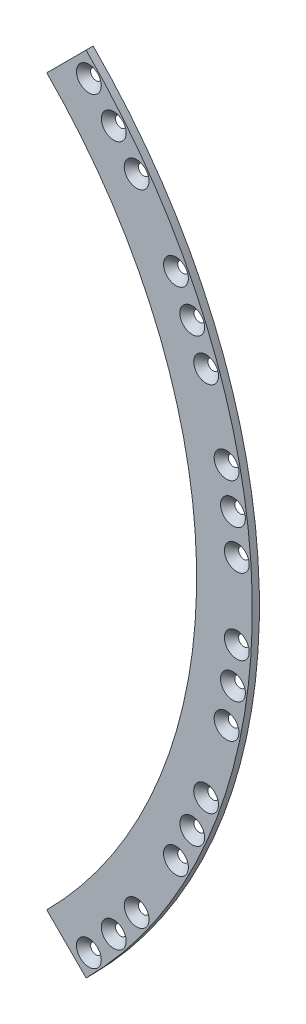
ISO-10303-21;
HEADER;
FILE_DESCRIPTION(('STEP AP214'),'2;1');
FILE_NAME('part.step','',(''),(''),'','','');
FILE_SCHEMA(('AUTOMOTIVE_DESIGN { 1 0 10303 214 1 1 1 1 }'));
ENDSEC;
DATA;
#1=APPLICATION_CONTEXT('core data for automotive mechanical design processes');
#2=APPLICATION_PROTOCOL_DEFINITION('international standard','automotive_design',2000,#1);
#3=PRODUCT_CONTEXT('',#1,'mechanical');
#4=PRODUCT('Part','Part','',(#3));
#5=PRODUCT_RELATED_PRODUCT_CATEGORY('part','',(#4));
#6=PRODUCT_DEFINITION_FORMATION('','',#4);
#7=PRODUCT_DEFINITION_CONTEXT('part definition',#1,'design');
#8=PRODUCT_DEFINITION('design','',#6,#7);
#9=PRODUCT_DEFINITION_SHAPE('','',#8);
#10=(LENGTH_UNIT() NAMED_UNIT(*) SI_UNIT(.MILLI.,.METRE.));
#11=(NAMED_UNIT(*) PLANE_ANGLE_UNIT() SI_UNIT($,.RADIAN.));
#12=(NAMED_UNIT(*) SI_UNIT($,.STERADIAN.) SOLID_ANGLE_UNIT());
#13=UNCERTAINTY_MEASURE_WITH_UNIT(LENGTH_MEASURE(1.E-05),#10,'distance_accuracy_value','');
#14=(GEOMETRIC_REPRESENTATION_CONTEXT(3) GLOBAL_UNCERTAINTY_ASSIGNED_CONTEXT((#13)) GLOBAL_UNIT_ASSIGNED_CONTEXT((#10,
#11,#12)) REPRESENTATION_CONTEXT('',''));
#15=CARTESIAN_POINT('',(0.,0.,0.));
#16=DIRECTION('',(0.,0.,1.));
#17=DIRECTION('',(1.,0.,0.));
#18=AXIS2_PLACEMENT_3D('',#15,#16,#17);
#19=CARTESIAN_POINT('',(0.,0.,2.));
#20=DIRECTION('',(0.,0.,-1.));
#21=DIRECTION('',(-1.,0.,0.));
#22=AXIS2_PLACEMENT_3D('',#19,#20,#21);
#23=PLANE('',#22);
#24=CARTESIAN_POINT('',(114.302744813103,-106.751311599393,2.));
#25=DIRECTION('',(0.,0.,-1.));
#26=DIRECTION('',(-1.,0.,0.));
#27=AXIS2_PLACEMENT_3D('',#24,#25,#26);
#28=CIRCLE('',#27,3.49999999998619);
#29=CARTESIAN_POINT('',(110.802744813116,-106.751311599393,2.));
#30=VERTEX_POINT('',#29);
#31=EDGE_CURVE('E11',#30,#30,#28,.T.);
#32=ORIENTED_EDGE('',*,*,#31,.T.);
#33=EDGE_LOOP('',(#32));
#34=FACE_BOUND('',#33,.T.);
#35=CARTESIAN_POINT('',(121.321245866172,-98.702154492594,2.));
#36=DIRECTION('',(0.,0.,-1.));
#37=DIRECTION('',(-1.,0.,0.));
#38=AXIS2_PLACEMENT_3D('',#35,#36,#37);
#39=CIRCLE('',#38,3.5);
#40=CARTESIAN_POINT('',(117.821245866172,-98.702154492594,2.));
#41=VERTEX_POINT('',#40);
#42=EDGE_CURVE('E41',#41,#41,#39,.T.);
#43=ORIENTED_EDGE('',*,*,#42,.T.);
#44=EDGE_LOOP('',(#43));
#45=FACE_BOUND('',#44,.T.);
#46=CARTESIAN_POINT('',(127.774091266831,-90.1928023787678,2.));
#47=DIRECTION('',(0.,0.,-1.));
#48=DIRECTION('',(-1.,0.,0.));
#49=AXIS2_PLACEMENT_3D('',#46,#47,#48);
#50=CIRCLE('',#49,3.50000000000325);
#51=CARTESIAN_POINT('',(124.274091266828,-90.1928023787678,2.));
#52=VERTEX_POINT('',#51);
#53=EDGE_CURVE('E152',#52,#52,#50,.T.);
#54=ORIENTED_EDGE('',*,*,#53,.T.);
#55=EDGE_LOOP('',(#54));
#56=FACE_BOUND('',#55,.T.);
#57=CARTESIAN_POINT('',(138.865248158134,-71.9541719011468,2.));
#58=DIRECTION('',(0.,0.,-1.));
#59=DIRECTION('',(-1.,0.,0.));
#60=AXIS2_PLACEMENT_3D('',#57,#58,#59);
#61=CIRCLE('',#60,3.4999999999889);
#62=CARTESIAN_POINT('',(135.365248158145,-71.9541719011468,2.));
#63=VERTEX_POINT('',#62);
#64=EDGE_CURVE('E149',#63,#63,#61,.T.);
#65=ORIENTED_EDGE('',*,*,#64,.T.);
#66=EDGE_LOOP('',(#65));
#67=FACE_BOUND('',#66,.T.);
#68=CARTESIAN_POINT('',(143.451847555453,-62.3099304519513,2.));
#69=DIRECTION('',(0.,0.,-1.));
#70=DIRECTION('',(-1.,0.,0.));
#71=AXIS2_PLACEMENT_3D('',#68,#69,#70);
#72=CIRCLE('',#71,3.5);
#73=CARTESIAN_POINT('',(139.951847555453,-62.3099304519513,2.));
#74=VERTEX_POINT('',#73);
#75=EDGE_CURVE('E146',#74,#74,#72,.T.);
#76=ORIENTED_EDGE('',*,*,#75,.T.);
#77=EDGE_LOOP('',(#76));
#78=FACE_BOUND('',#77,.T.);
#79=CARTESIAN_POINT('',(147.369608219383,-52.3751713435451,2.));
#80=DIRECTION('',(0.,0.,-1.));
#81=DIRECTION('',(-1.,0.,0.));
#82=AXIS2_PLACEMENT_3D('',#79,#80,#81);
#83=CIRCLE('',#82,3.5000000000025);
#84=CARTESIAN_POINT('',(143.86960821938,-52.3751713435451,2.));
#85=VERTEX_POINT('',#84);
#86=EDGE_CURVE('E143',#85,#85,#83,.T.);
#87=ORIENTED_EDGE('',*,*,#86,.T.);
#88=EDGE_LOOP('',(#87));
#89=FACE_BOUND('',#88,.T.);
#90=CARTESIAN_POINT('',(153.128751313515,-31.8205204414349,2.));
#91=DIRECTION('',(0.,0.,-1.));
#92=DIRECTION('',(-1.,0.,0.));
#93=AXIS2_PLACEMENT_3D('',#90,#91,#92);
#94=CIRCLE('',#93,3.50000000000203);
#95=CARTESIAN_POINT('',(149.628751313513,-31.8205204414349,2.));
#96=VERTEX_POINT('',#95);
#97=EDGE_CURVE('E140',#96,#96,#94,.T.);
#98=ORIENTED_EDGE('',*,*,#97,.T.);
#99=EDGE_LOOP('',(#98));
#100=FACE_BOUND('',#99,.T.);
#101=CARTESIAN_POINT('',(154.943281960082,-21.296463918652,2.));
#102=DIRECTION('',(0.,0.,-1.));
#103=DIRECTION('',(-1.,0.,0.));
#104=AXIS2_PLACEMENT_3D('',#101,#102,#103);
#105=CIRCLE('',#104,3.5);
#106=CARTESIAN_POINT('',(151.443281960082,-21.296463918652,2.));
#107=VERTEX_POINT('',#106);
#108=EDGE_CURVE('E137',#107,#107,#105,.T.);
#109=ORIENTED_EDGE('',*,*,#108,.T.);
#110=EDGE_LOOP('',(#109));
#111=FACE_BOUND('',#110,.T.);
#112=CARTESIAN_POINT('',(156.0353955014,-10.6731134502375,2.));
#113=DIRECTION('',(0.,0.,-1.));
#114=DIRECTION('',(-1.,0.,0.));
#115=AXIS2_PLACEMENT_3D('',#112,#113,#114);
#116=CIRCLE('',#115,3.50000000000156);
#117=CARTESIAN_POINT('',(152.535395501399,-10.6731134502375,2.));
#118=VERTEX_POINT('',#117);
#119=EDGE_CURVE('E134',#118,#118,#116,.T.);
#120=ORIENTED_EDGE('',*,*,#119,.T.);
#121=EDGE_LOOP('',(#120));
#122=FACE_BOUND('',#121,.T.);
#123=CARTESIAN_POINT('',(156.035395501401,10.6731134502307,2.));
#124=DIRECTION('',(0.,0.,-1.));
#125=DIRECTION('',(-1.,0.,0.));
#126=AXIS2_PLACEMENT_3D('',#123,#124,#125);
#127=CIRCLE('',#126,3.50000000000014);
#128=CARTESIAN_POINT('',(152.5353955014,10.6731134502307,2.));
#129=VERTEX_POINT('',#128);
#130=EDGE_CURVE('E131',#129,#129,#127,.T.);
#131=ORIENTED_EDGE('',*,*,#130,.T.);
#132=EDGE_LOOP('',(#131));
#133=FACE_BOUND('',#132,.T.);
#134=CARTESIAN_POINT('',(154.943281960082,21.2964639186541,2.));
#135=DIRECTION('',(0.,0.,-1.));
#136=DIRECTION('',(-1.,0.,0.));
#137=AXIS2_PLACEMENT_3D('',#134,#135,#136);
#138=CIRCLE('',#137,3.5);
#139=CARTESIAN_POINT('',(151.443281960082,21.2964639186541,2.));
#140=VERTEX_POINT('',#139);
#141=EDGE_CURVE('E128',#140,#140,#138,.T.);
#142=ORIENTED_EDGE('',*,*,#141,.T.);
#143=EDGE_LOOP('',(#142));
#144=FACE_BOUND('',#143,.T.);
#145=CARTESIAN_POINT('',(153.128751313516,31.8205204414281,2.));
#146=DIRECTION('',(0.,0.,-1.));
#147=DIRECTION('',(-1.,0.,0.));
#148=AXIS2_PLACEMENT_3D('',#145,#146,#147);
#149=CIRCLE('',#148,3.49999999999998);
#150=CARTESIAN_POINT('',(149.628751313516,31.8205204414281,2.));
#151=VERTEX_POINT('',#150);
#152=EDGE_CURVE('E125',#151,#151,#149,.T.);
#153=ORIENTED_EDGE('',*,*,#152,.T.);
#154=EDGE_LOOP('',(#153));
#155=FACE_BOUND('',#154,.T.);
#156=CARTESIAN_POINT('',(147.369608219384,52.3751713435407,2.));
#157=DIRECTION('',(0.,0.,-1.));
#158=DIRECTION('',(-1.,0.,0.));
#159=AXIS2_PLACEMENT_3D('',#156,#157,#158);
#160=CIRCLE('',#159,3.50000000000006);
#161=CARTESIAN_POINT('',(143.869608219384,52.3751713435407,2.));
#162=VERTEX_POINT('',#161);
#163=EDGE_CURVE('E122',#162,#162,#160,.T.);
#164=ORIENTED_EDGE('',*,*,#163,.T.);
#165=EDGE_LOOP('',(#164));
#166=FACE_BOUND('',#165,.T.);
#167=CARTESIAN_POINT('',(143.451847555452,62.3099304519534,2.));
#168=DIRECTION('',(0.,0.,-1.));
#169=DIRECTION('',(-1.,0.,0.));
#170=AXIS2_PLACEMENT_3D('',#167,#168,#169);
#171=CIRCLE('',#170,3.49999999999998);
#172=CARTESIAN_POINT('',(139.951847555452,62.3099304519534,2.));
#173=VERTEX_POINT('',#172);
#174=EDGE_CURVE('E119',#173,#173,#171,.T.);
#175=ORIENTED_EDGE('',*,*,#174,.T.);
#176=EDGE_LOOP('',(#175));
#177=FACE_BOUND('',#176,.T.);
#178=CARTESIAN_POINT('',(138.865248158133,71.9541719011488,2.));
#179=DIRECTION('',(0.,0.,-1.));
#180=DIRECTION('',(-1.,0.,0.));
#181=AXIS2_PLACEMENT_3D('',#178,#179,#180);
#182=CIRCLE('',#181,3.5);
#183=CARTESIAN_POINT('',(135.365248158133,71.9541719011488,2.));
#184=VERTEX_POINT('',#183);
#185=EDGE_CURVE('E116',#184,#184,#182,.T.);
#186=ORIENTED_EDGE('',*,*,#185,.T.);
#187=EDGE_LOOP('',(#186));
#188=FACE_BOUND('',#187,.T.);
#189=CARTESIAN_POINT('',(127.774091266834,90.1928023787642,2.));
#190=DIRECTION('',(0.,0.,-1.));
#191=DIRECTION('',(-1.,0.,0.));
#192=AXIS2_PLACEMENT_3D('',#189,#190,#191);
#193=CIRCLE('',#192,3.50000000000042);
#194=CARTESIAN_POINT('',(124.274091266834,90.1928023787642,2.));
#195=VERTEX_POINT('',#194);
#196=EDGE_CURVE('E113',#195,#195,#193,.T.);
#197=ORIENTED_EDGE('',*,*,#196,.T.);
#198=EDGE_LOOP('',(#197));
#199=FACE_BOUND('',#198,.T.);
#200=CARTESIAN_POINT('',(121.32124586617,98.7021544925957,2.));
#201=DIRECTION('',(0.,0.,-1.));
#202=DIRECTION('',(-1.,0.,0.));
#203=AXIS2_PLACEMENT_3D('',#200,#201,#202);
#204=CIRCLE('',#203,3.5);
#205=CARTESIAN_POINT('',(117.82124586617,98.7021544925957,2.));
#206=VERTEX_POINT('',#205);
#207=EDGE_CURVE('E110',#206,#206,#204,.T.);
#208=ORIENTED_EDGE('',*,*,#207,.T.);
#209=EDGE_LOOP('',(#208));
#210=FACE_BOUND('',#209,.T.);
#211=CARTESIAN_POINT('',(114.302744813101,106.751311599395,2.));
#212=DIRECTION('',(0.,0.,-1.));
#213=DIRECTION('',(-1.,0.,0.));
#214=AXIS2_PLACEMENT_3D('',#211,#212,#213);
#215=CIRCLE('',#214,3.49999999999304);
#216=CARTESIAN_POINT('',(110.802744813108,106.751311599395,2.));
#217=VERTEX_POINT('',#216);
#218=EDGE_CURVE('E107',#217,#217,#215,.T.);
#219=ORIENTED_EDGE('',*,*,#218,.T.);
#220=EDGE_LOOP('',(#219));
#221=FACE_BOUND('',#220,.T.);
#222=CARTESIAN_POINT('',(0.,0.,2.));
#223=DIRECTION('',(0.,0.,1.));
#224=DIRECTION('',(-1.,0.,0.));
#225=AXIS2_PLACEMENT_3D('',#222,#223,#224);
#226=CIRCLE('',#225,160.4);
#227=CARTESIAN_POINT('',(113.525944125029,-113.313812090675,2.));
#228=VERTEX_POINT('',#227);
#229=CARTESIAN_POINT('',(113.525944125031,113.313812090673,2.));
#230=VERTEX_POINT('',#229);
#231=EDGE_CURVE('E86',#228,#230,#226,.T.);
#232=ORIENTED_EDGE('',*,*,#231,.T.);
#233=DIRECTION('',(0.707106781186548,0.707106781186547,0.));
#234=VECTOR('',#233,1.);
#235=CARTESIAN_POINT('',(117.105903569723,116.893771535365,2.));
#236=LINE('',#235,#234);
#237=CARTESIAN_POINT('',(102.424362279382,102.212230245024,2.));
#238=VERTEX_POINT('',#237);
#239=EDGE_CURVE('E328',#238,#230,#236,.T.);
#240=ORIENTED_EDGE('',*,*,#239,.F.);
#241=CARTESIAN_POINT('',(0.,0.,2.));
#242=DIRECTION('',(0.,0.,-1.));
#243=DIRECTION('',(-1.,0.,0.));
#244=AXIS2_PLACEMENT_3D('',#241,#242,#243);
#245=CIRCLE('',#244,144.7);
#246=CARTESIAN_POINT('',(102.42436227938,-102.212230245026,2.));
#247=VERTEX_POINT('',#246);
#248=EDGE_CURVE('E88',#238,#247,#245,.T.);
#249=ORIENTED_EDGE('',*,*,#248,.T.);
#250=DIRECTION('',(-0.707106781186548,0.707106781186547,0.));
#251=VECTOR('',#250,1.);
#252=CARTESIAN_POINT('',(94.9530946684338,-94.7409626340794,2.));
#253=LINE('',#252,#251);
#254=EDGE_CURVE('E48',#228,#247,#253,.T.);
#255=ORIENTED_EDGE('',*,*,#254,.F.);
#256=EDGE_LOOP('',(#232,#240,#249,#255));
#257=FACE_BOUND('',#256,.T.);
#258=ADVANCED_FACE('F33',(#34,#45,#56,#67,#78,#89,#100,#111,#122,#133,#144,#155,#166,#177,#188,
#199,#210,#221,#257),#23,.F.);
#259=CARTESIAN_POINT('',(0.,0.,0.));
#260=DIRECTION('',(0.,0.,-1.));
#261=DIRECTION('',(-1.,0.,0.));
#262=AXIS2_PLACEMENT_3D('',#259,#260,#261);
#263=PLANE('',#262);
#264=DIRECTION('',(0.707106781186548,0.707106781186547,0.));
#265=VECTOR('',#264,1.);
#266=CARTESIAN_POINT('',(117.105903569723,116.893771535365,0.));
#267=LINE('',#266,#265);
#268=CARTESIAN_POINT('',(102.424362279382,102.212230245024,0.));
#269=VERTEX_POINT('',#268);
#270=CARTESIAN_POINT('',(113.525944125031,113.313812090673,0.));
#271=VERTEX_POINT('',#270);
#272=EDGE_CURVE('E56',#269,#271,#267,.T.);
#273=ORIENTED_EDGE('',*,*,#272,.T.);
#274=CARTESIAN_POINT('',(0.,0.,0.));
#275=DIRECTION('',(0.,0.,1.));
#276=DIRECTION('',(-1.,0.,0.));
#277=AXIS2_PLACEMENT_3D('',#274,#275,#276);
#278=CIRCLE('',#277,160.4);
#279=CARTESIAN_POINT('',(113.525944125029,-113.313812090675,0.));
#280=VERTEX_POINT('',#279);
#281=EDGE_CURVE('E97',#280,#271,#278,.T.);
#282=ORIENTED_EDGE('',*,*,#281,.F.);
#283=DIRECTION('',(-0.707106781186548,0.707106781186547,0.));
#284=VECTOR('',#283,1.);
#285=CARTESIAN_POINT('',(94.9530946684338,-94.7409626340794,0.));
#286=LINE('',#285,#284);
#287=CARTESIAN_POINT('',(102.42436227938,-102.212230245026,0.));
#288=VERTEX_POINT('',#287);
#289=EDGE_CURVE('E75',#280,#288,#286,.T.);
#290=ORIENTED_EDGE('',*,*,#289,.T.);
#291=CARTESIAN_POINT('',(0.,0.,0.));
#292=DIRECTION('',(0.,0.,-1.));
#293=DIRECTION('',(-1.,0.,0.));
#294=AXIS2_PLACEMENT_3D('',#291,#292,#293);
#295=CIRCLE('',#294,144.7);
#296=EDGE_CURVE('E92',#269,#288,#295,.T.);
#297=ORIENTED_EDGE('',*,*,#296,.F.);
#298=EDGE_LOOP('',(#273,#282,#290,#297));
#299=FACE_BOUND('',#298,.T.);
#300=CARTESIAN_POINT('',(138.865248158134,-71.9541719011468,0.));
#301=DIRECTION('',(0.,0.,1.));
#302=DIRECTION('',(1.,0.,0.));
#303=AXIS2_PLACEMENT_3D('',#300,#301,#302);
#304=CIRCLE('',#303,1.49999999998889);
#305=CARTESIAN_POINT('',(140.365248158123,-71.9541719011468,0.));
#306=VERTEX_POINT('',#305);
#307=EDGE_CURVE('E285',#306,#306,#304,.T.);
#308=ORIENTED_EDGE('',*,*,#307,.T.);
#309=EDGE_LOOP('',(#308));
#310=FACE_BOUND('',#309,.T.);
#311=CARTESIAN_POINT('',(114.302744813101,106.751311599395,0.));
#312=DIRECTION('',(0.,0.,1.));
#313=DIRECTION('',(1.,0.,0.));
#314=AXIS2_PLACEMENT_3D('',#311,#312,#313);
#315=CIRCLE('',#314,1.49999999999302);
#316=CARTESIAN_POINT('',(115.802744813094,106.751311599395,0.));
#317=VERTEX_POINT('',#316);
#318=EDGE_CURVE('E284',#317,#317,#315,.T.);
#319=ORIENTED_EDGE('',*,*,#318,.T.);
#320=EDGE_LOOP('',(#319));
#321=FACE_BOUND('',#320,.T.);
#322=CARTESIAN_POINT('',(153.128751313515,-31.8205204414349,0.));
#323=DIRECTION('',(0.,0.,1.));
#324=DIRECTION('',(-1.,0.,0.));
#325=AXIS2_PLACEMENT_3D('',#322,#323,#324);
#326=CIRCLE('',#325,1.50000000000204);
#327=CARTESIAN_POINT('',(151.628751313513,-31.8205204414349,0.));
#328=VERTEX_POINT('',#327);
#329=EDGE_CURVE('E297',#328,#328,#326,.T.);
#330=ORIENTED_EDGE('',*,*,#329,.T.);
#331=EDGE_LOOP('',(#330));
#332=FACE_BOUND('',#331,.T.);
#333=CARTESIAN_POINT('',(127.774091266831,-90.1928023787678,0.));
#334=DIRECTION('',(0.,0.,1.));
#335=DIRECTION('',(-1.,0.,0.));
#336=AXIS2_PLACEMENT_3D('',#333,#334,#335);
#337=CIRCLE('',#336,1.50000000000326);
#338=CARTESIAN_POINT('',(126.274091266828,-90.1928023787678,0.));
#339=VERTEX_POINT('',#338);
#340=EDGE_CURVE('E303',#339,#339,#337,.T.);
#341=ORIENTED_EDGE('',*,*,#340,.T.);
#342=EDGE_LOOP('',(#341));
#343=FACE_BOUND('',#342,.T.);
#344=CARTESIAN_POINT('',(153.128751313516,31.8205204414281,0.));
#345=DIRECTION('',(0.,0.,1.));
#346=DIRECTION('',(-1.,0.,0.));
#347=AXIS2_PLACEMENT_3D('',#344,#345,#346);
#348=CIRCLE('',#347,1.49999999999999);
#349=CARTESIAN_POINT('',(151.628751313516,31.8205204414281,0.));
#350=VERTEX_POINT('',#349);
#351=EDGE_CURVE('E309',#350,#350,#348,.T.);
#352=ORIENTED_EDGE('',*,*,#351,.T.);
#353=EDGE_LOOP('',(#352));
#354=FACE_BOUND('',#353,.T.);
#355=CARTESIAN_POINT('',(127.774091266834,90.1928023787642,0.));
#356=DIRECTION('',(0.,0.,1.));
#357=DIRECTION('',(-1.,0.,0.));
#358=AXIS2_PLACEMENT_3D('',#355,#356,#357);
#359=CIRCLE('',#358,1.50000000000042);
#360=CARTESIAN_POINT('',(126.274091266834,90.1928023787642,0.));
#361=VERTEX_POINT('',#360);
#362=EDGE_CURVE('E170',#361,#361,#359,.T.);
#363=ORIENTED_EDGE('',*,*,#362,.T.);
#364=EDGE_LOOP('',(#363));
#365=FACE_BOUND('',#364,.T.);
#366=CARTESIAN_POINT('',(143.451847555453,-62.3099304519513,0.));
#367=DIRECTION('',(0.,0.,1.));
#368=DIRECTION('',(1.,0.,0.));
#369=AXIS2_PLACEMENT_3D('',#366,#367,#368);
#370=CIRCLE('',#369,1.5);
#371=CARTESIAN_POINT('',(144.951847555453,-62.3099304519513,0.));
#372=VERTEX_POINT('',#371);
#373=EDGE_CURVE('E169',#372,#372,#370,.T.);
#374=ORIENTED_EDGE('',*,*,#373,.T.);
#375=EDGE_LOOP('',(#374));
#376=FACE_BOUND('',#375,.T.);
#377=CARTESIAN_POINT('',(154.943281960082,21.2964639186541,0.));
#378=DIRECTION('',(0.,0.,1.));
#379=DIRECTION('',(1.,0.,0.));
#380=AXIS2_PLACEMENT_3D('',#377,#378,#379);
#381=CIRCLE('',#380,1.5);
#382=CARTESIAN_POINT('',(156.443281960082,21.2964639186541,0.));
#383=VERTEX_POINT('',#382);
#384=EDGE_CURVE('E182',#383,#383,#381,.T.);
#385=ORIENTED_EDGE('',*,*,#384,.T.);
#386=EDGE_LOOP('',(#385));
#387=FACE_BOUND('',#386,.T.);
#388=CARTESIAN_POINT('',(121.32124586617,98.7021544925957,0.));
#389=DIRECTION('',(0.,0.,1.));
#390=DIRECTION('',(1.,0.,0.));
#391=AXIS2_PLACEMENT_3D('',#388,#389,#390);
#392=CIRCLE('',#391,1.5);
#393=CARTESIAN_POINT('',(122.82124586617,98.7021544925957,0.));
#394=VERTEX_POINT('',#393);
#395=EDGE_CURVE('E100',#394,#394,#392,.T.);
#396=ORIENTED_EDGE('',*,*,#395,.T.);
#397=EDGE_LOOP('',(#396));
#398=FACE_BOUND('',#397,.T.);
#399=CARTESIAN_POINT('',(143.451847555452,62.3099304519534,0.));
#400=DIRECTION('',(0.,0.,1.));
#401=DIRECTION('',(1.,0.,0.));
#402=AXIS2_PLACEMENT_3D('',#399,#400,#401);
#403=CIRCLE('',#402,1.5);
#404=CARTESIAN_POINT('',(144.951847555452,62.3099304519534,0.));
#405=VERTEX_POINT('',#404);
#406=EDGE_CURVE('E184',#405,#405,#403,.T.);
#407=ORIENTED_EDGE('',*,*,#406,.T.);
#408=EDGE_LOOP('',(#407));
#409=FACE_BOUND('',#408,.T.);
#410=CARTESIAN_POINT('',(154.943281960082,-21.296463918652,0.));
#411=DIRECTION('',(0.,0.,1.));
#412=DIRECTION('',(1.,0.,0.));
#413=AXIS2_PLACEMENT_3D('',#410,#411,#412);
#414=CIRCLE('',#413,1.5);
#415=CARTESIAN_POINT('',(156.443281960082,-21.296463918652,0.));
#416=VERTEX_POINT('',#415);
#417=EDGE_CURVE('E173',#416,#416,#414,.T.);
#418=ORIENTED_EDGE('',*,*,#417,.T.);
#419=EDGE_LOOP('',(#418));
#420=FACE_BOUND('',#419,.T.);
#421=CARTESIAN_POINT('',(121.321245866172,-98.702154492594,0.));
#422=DIRECTION('',(0.,0.,1.));
#423=DIRECTION('',(1.,0.,0.));
#424=AXIS2_PLACEMENT_3D('',#421,#422,#423);
#425=CIRCLE('',#424,1.5);
#426=CARTESIAN_POINT('',(122.821245866172,-98.702154492594,0.));
#427=VERTEX_POINT('',#426);
#428=EDGE_CURVE('E167',#427,#427,#425,.T.);
#429=ORIENTED_EDGE('',*,*,#428,.T.);
#430=EDGE_LOOP('',(#429));
#431=FACE_BOUND('',#430,.T.);
#432=CARTESIAN_POINT('',(147.369608219384,52.3751713435407,0.));
#433=DIRECTION('',(0.,0.,1.));
#434=DIRECTION('',(-1.,0.,0.));
#435=AXIS2_PLACEMENT_3D('',#432,#433,#434);
#436=CIRCLE('',#435,1.50000000000004);
#437=CARTESIAN_POINT('',(145.869608219384,52.3751713435407,0.));
#438=VERTEX_POINT('',#437);
#439=EDGE_CURVE('E176',#438,#438,#436,.T.);
#440=ORIENTED_EDGE('',*,*,#439,.T.);
#441=EDGE_LOOP('',(#440));
#442=FACE_BOUND('',#441,.T.);
#443=CARTESIAN_POINT('',(156.035395501401,10.6731134502307,0.));
#444=DIRECTION('',(0.,0.,1.));
#445=DIRECTION('',(-1.,0.,0.));
#446=AXIS2_PLACEMENT_3D('',#443,#444,#445);
#447=CIRCLE('',#446,1.50000000000013);
#448=CARTESIAN_POINT('',(154.535395501401,10.6731134502307,0.));
#449=VERTEX_POINT('',#448);
#450=EDGE_CURVE('E306',#449,#449,#447,.T.);
#451=ORIENTED_EDGE('',*,*,#450,.T.);
#452=EDGE_LOOP('',(#451));
#453=FACE_BOUND('',#452,.T.);
#454=CARTESIAN_POINT('',(147.369608219383,-52.3751713435451,0.));
#455=DIRECTION('',(0.,0.,1.));
#456=DIRECTION('',(-1.,0.,0.));
#457=AXIS2_PLACEMENT_3D('',#454,#455,#456);
#458=CIRCLE('',#457,1.50000000000247);
#459=CARTESIAN_POINT('',(145.86960821938,-52.3751713435451,0.));
#460=VERTEX_POINT('',#459);
#461=EDGE_CURVE('E300',#460,#460,#458,.T.);
#462=ORIENTED_EDGE('',*,*,#461,.T.);
#463=EDGE_LOOP('',(#462));
#464=FACE_BOUND('',#463,.T.);
#465=CARTESIAN_POINT('',(156.0353955014,-10.6731134502375,0.));
#466=DIRECTION('',(0.,0.,1.));
#467=DIRECTION('',(-1.,0.,0.));
#468=AXIS2_PLACEMENT_3D('',#465,#466,#467);
#469=CIRCLE('',#468,1.50000000000151);
#470=CARTESIAN_POINT('',(154.535395501399,-10.6731134502375,0.));
#471=VERTEX_POINT('',#470);
#472=EDGE_CURVE('E288',#471,#471,#469,.T.);
#473=ORIENTED_EDGE('',*,*,#472,.T.);
#474=EDGE_LOOP('',(#473));
#475=FACE_BOUND('',#474,.T.);
#476=CARTESIAN_POINT('',(138.865248158133,71.9541719011488,0.));
#477=DIRECTION('',(0.,0.,1.));
#478=DIRECTION('',(1.,0.,0.));
#479=AXIS2_PLACEMENT_3D('',#476,#477,#478);
#480=CIRCLE('',#479,1.5);
#481=CARTESIAN_POINT('',(140.365248158133,71.9541719011488,0.));
#482=VERTEX_POINT('',#481);
#483=EDGE_CURVE('E282',#482,#482,#480,.T.);
#484=ORIENTED_EDGE('',*,*,#483,.T.);
#485=EDGE_LOOP('',(#484));
#486=FACE_BOUND('',#485,.T.);
#487=CARTESIAN_POINT('',(114.302744813103,-106.751311599393,0.));
#488=DIRECTION('',(0.,0.,1.));
#489=DIRECTION('',(1.,0.,0.));
#490=AXIS2_PLACEMENT_3D('',#487,#488,#489);
#491=CIRCLE('',#490,1.49999999998617);
#492=CARTESIAN_POINT('',(115.802744813089,-106.751311599393,0.));
#493=VERTEX_POINT('',#492);
#494=EDGE_CURVE('E291',#493,#493,#491,.T.);
#495=ORIENTED_EDGE('',*,*,#494,.T.);
#496=EDGE_LOOP('',(#495));
#497=FACE_BOUND('',#496,.T.);
#498=ADVANCED_FACE('F191',(#299,#310,#321,#332,#343,#354,#365,#376,#387,#398,#409,#420,#431,
#442,#453,#464,#475,#486,#497),#263,.T.);
#499=CARTESIAN_POINT('',(0.,0.,2.));
#500=DIRECTION('',(0.,0.,-1.));
#501=DIRECTION('',(-1.,0.,0.));
#502=AXIS2_PLACEMENT_3D('',#499,#500,#501);
#503=CYLINDRICAL_SURFACE('',#502,160.4);
#504=ORIENTED_EDGE('',*,*,#281,.T.);
#505=DIRECTION('',(0.,0.,-1.));
#506=VECTOR('',#505,1.);
#507=CARTESIAN_POINT('',(113.525944125031,113.313812090673,2.));
#508=LINE('',#507,#506);
#509=EDGE_CURVE('E80',#271,#230,#508,.F.);
#510=ORIENTED_EDGE('',*,*,#509,.T.);
#511=ORIENTED_EDGE('',*,*,#231,.F.);
#512=DIRECTION('',(0.,0.,-1.));
#513=VECTOR('',#512,1.);
#514=CARTESIAN_POINT('',(113.525944125029,-113.313812090675,2.));
#515=LINE('',#514,#513);
#516=EDGE_CURVE('E72',#228,#280,#515,.T.);
#517=ORIENTED_EDGE('',*,*,#516,.T.);
#518=EDGE_LOOP('',(#504,#510,#511,#517));
#519=FACE_BOUND('',#518,.T.);
#520=ADVANCED_FACE('F91',(#519),#503,.T.);
#521=CARTESIAN_POINT('',(0.,0.,2.));
#522=DIRECTION('',(0.,0.,-1.));
#523=DIRECTION('',(-1.,0.,0.));
#524=AXIS2_PLACEMENT_3D('',#521,#522,#523);
#525=CYLINDRICAL_SURFACE('',#524,144.7);
#526=ORIENTED_EDGE('',*,*,#248,.F.);
#527=DIRECTION('',(0.,0.,-1.));
#528=VECTOR('',#527,1.);
#529=CARTESIAN_POINT('',(102.424362279382,102.212230245024,2.));
#530=LINE('',#529,#528);
#531=EDGE_CURVE('E105',#238,#269,#530,.T.);
#532=ORIENTED_EDGE('',*,*,#531,.T.);
#533=ORIENTED_EDGE('',*,*,#296,.T.);
#534=DIRECTION('',(0.,0.,-1.));
#535=VECTOR('',#534,1.);
#536=CARTESIAN_POINT('',(102.42436227938,-102.212230245026,2.));
#537=LINE('',#536,#535);
#538=EDGE_CURVE('E94',#288,#247,#537,.F.);
#539=ORIENTED_EDGE('',*,*,#538,.T.);
#540=EDGE_LOOP('',(#526,#532,#533,#539));
#541=FACE_BOUND('',#540,.T.);
#542=ADVANCED_FACE('F217',(#541),#525,.F.);
#543=CARTESIAN_POINT('',(94.9530946684338,-94.7409626340794,0.));
#544=DIRECTION('',(0.707106781186547,0.707106781186548,0.));
#545=DIRECTION('',(-0.707106781186548,0.707106781186547,0.));
#546=AXIS2_PLACEMENT_3D('',#543,#544,#545);
#547=PLANE('',#546);
#548=ORIENTED_EDGE('',*,*,#254,.T.);
#549=ORIENTED_EDGE('',*,*,#538,.F.);
#550=ORIENTED_EDGE('',*,*,#289,.F.);
#551=ORIENTED_EDGE('',*,*,#516,.F.);
#552=EDGE_LOOP('',(#548,#549,#550,#551));
#553=FACE_BOUND('',#552,.T.);
#554=ADVANCED_FACE('F73',(#553),#547,.F.);
#555=CARTESIAN_POINT('',(117.105903569723,116.893771535365,0.));
#556=DIRECTION('',(0.707106781186547,-0.707106781186548,0.));
#557=DIRECTION('',(0.707106781186548,0.707106781186547,0.));
#558=AXIS2_PLACEMENT_3D('',#555,#556,#557);
#559=PLANE('',#558);
#560=ORIENTED_EDGE('',*,*,#272,.F.);
#561=ORIENTED_EDGE('',*,*,#531,.F.);
#562=ORIENTED_EDGE('',*,*,#239,.T.);
#563=ORIENTED_EDGE('',*,*,#509,.F.);
#564=EDGE_LOOP('',(#560,#561,#562,#563));
#565=FACE_BOUND('',#564,.T.);
#566=ADVANCED_FACE('F224',(#565),#559,.F.);
#567=CARTESIAN_POINT('',(114.302744813103,-106.751311599393,0.));
#568=DIRECTION('',(0.,0.,1.));
#569=DIRECTION('',(1.,0.,0.));
#570=AXIS2_PLACEMENT_3D('',#567,#568,#569);
#571=CONICAL_SURFACE('',#570,1.49999999998617,0.785398163397457);
#572=ORIENTED_EDGE('',*,*,#31,.F.);
#573=EDGE_LOOP('',(#572));
#574=FACE_BOUND('',#573,.T.);
#575=ORIENTED_EDGE('',*,*,#494,.F.);
#576=EDGE_LOOP('',(#575));
#577=FACE_BOUND('',#576,.T.);
#578=ADVANCED_FACE('F163',(#574,#577),#571,.F.);
#579=CARTESIAN_POINT('',(121.321245866172,-98.702154492594,0.));
#580=DIRECTION('',(0.,0.,1.));
#581=DIRECTION('',(1.,0.,0.));
#582=AXIS2_PLACEMENT_3D('',#579,#580,#581);
#583=CONICAL_SURFACE('',#582,1.5,0.785398163397447);
#584=ORIENTED_EDGE('',*,*,#42,.F.);
#585=EDGE_LOOP('',(#584));
#586=FACE_BOUND('',#585,.T.);
#587=ORIENTED_EDGE('',*,*,#428,.F.);
#588=EDGE_LOOP('',(#587));
#589=FACE_BOUND('',#588,.T.);
#590=ADVANCED_FACE('F159',(#586,#589),#583,.F.);
#591=CARTESIAN_POINT('',(127.774091266831,-90.1928023787678,0.));
#592=DIRECTION('',(0.,0.,1.));
#593=DIRECTION('',(1.,0.,0.));
#594=AXIS2_PLACEMENT_3D('',#591,#592,#593);
#595=CONICAL_SURFACE('',#594,1.50000000000326,0.785398163397447);
#596=ORIENTED_EDGE('',*,*,#53,.F.);
#597=EDGE_LOOP('',(#596));
#598=FACE_BOUND('',#597,.T.);
#599=ORIENTED_EDGE('',*,*,#340,.F.);
#600=EDGE_LOOP('',(#599));
#601=FACE_BOUND('',#600,.T.);
#602=ADVANCED_FACE('F162',(#598,#601),#595,.F.);
#603=CARTESIAN_POINT('',(138.865248158134,-71.9541719011468,0.));
#604=DIRECTION('',(0.,0.,1.));
#605=DIRECTION('',(1.,0.,0.));
#606=AXIS2_PLACEMENT_3D('',#603,#604,#605);
#607=CONICAL_SURFACE('',#606,1.49999999998889,0.785398163397447);
#608=ORIENTED_EDGE('',*,*,#64,.F.);
#609=EDGE_LOOP('',(#608));
#610=FACE_BOUND('',#609,.T.);
#611=ORIENTED_EDGE('',*,*,#307,.F.);
#612=EDGE_LOOP('',(#611));
#613=FACE_BOUND('',#612,.T.);
#614=ADVANCED_FACE('F229',(#610,#613),#607,.F.);
#615=CARTESIAN_POINT('',(143.451847555453,-62.3099304519513,0.));
#616=DIRECTION('',(0.,0.,1.));
#617=DIRECTION('',(1.,0.,0.));
#618=AXIS2_PLACEMENT_3D('',#615,#616,#617);
#619=CONICAL_SURFACE('',#618,1.5,0.785398163397447);
#620=ORIENTED_EDGE('',*,*,#75,.F.);
#621=EDGE_LOOP('',(#620));
#622=FACE_BOUND('',#621,.T.);
#623=ORIENTED_EDGE('',*,*,#373,.F.);
#624=EDGE_LOOP('',(#623));
#625=FACE_BOUND('',#624,.T.);
#626=ADVANCED_FACE('F233',(#622,#625),#619,.F.);
#627=CARTESIAN_POINT('',(147.369608219383,-52.3751713435451,0.));
#628=DIRECTION('',(0.,0.,1.));
#629=DIRECTION('',(1.,0.,0.));
#630=AXIS2_PLACEMENT_3D('',#627,#628,#629);
#631=CONICAL_SURFACE('',#630,1.50000000000247,0.785398163397447);
#632=ORIENTED_EDGE('',*,*,#86,.F.);
#633=EDGE_LOOP('',(#632));
#634=FACE_BOUND('',#633,.T.);
#635=ORIENTED_EDGE('',*,*,#461,.F.);
#636=EDGE_LOOP('',(#635));
#637=FACE_BOUND('',#636,.T.);
#638=ADVANCED_FACE('F237',(#634,#637),#631,.F.);
#639=CARTESIAN_POINT('',(153.128751313515,-31.8205204414349,0.));
#640=DIRECTION('',(0.,0.,1.));
#641=DIRECTION('',(1.,0.,0.));
#642=AXIS2_PLACEMENT_3D('',#639,#640,#641);
#643=CONICAL_SURFACE('',#642,1.50000000000204,0.785398163397447);
#644=ORIENTED_EDGE('',*,*,#97,.F.);
#645=EDGE_LOOP('',(#644));
#646=FACE_BOUND('',#645,.T.);
#647=ORIENTED_EDGE('',*,*,#329,.F.);
#648=EDGE_LOOP('',(#647));
#649=FACE_BOUND('',#648,.T.);
#650=ADVANCED_FACE('F241',(#646,#649),#643,.F.);
#651=CARTESIAN_POINT('',(154.943281960082,-21.296463918652,0.));
#652=DIRECTION('',(0.,0.,1.));
#653=DIRECTION('',(1.,0.,0.));
#654=AXIS2_PLACEMENT_3D('',#651,#652,#653);
#655=CONICAL_SURFACE('',#654,1.5,0.785398163397447);
#656=ORIENTED_EDGE('',*,*,#108,.F.);
#657=EDGE_LOOP('',(#656));
#658=FACE_BOUND('',#657,.T.);
#659=ORIENTED_EDGE('',*,*,#417,.F.);
#660=EDGE_LOOP('',(#659));
#661=FACE_BOUND('',#660,.T.);
#662=ADVANCED_FACE('F245',(#658,#661),#655,.F.);
#663=CARTESIAN_POINT('',(156.0353955014,-10.6731134502375,0.));
#664=DIRECTION('',(0.,0.,1.));
#665=DIRECTION('',(1.,0.,0.));
#666=AXIS2_PLACEMENT_3D('',#663,#664,#665);
#667=CONICAL_SURFACE('',#666,1.50000000000151,0.785398163397447);
#668=ORIENTED_EDGE('',*,*,#119,.F.);
#669=EDGE_LOOP('',(#668));
#670=FACE_BOUND('',#669,.T.);
#671=ORIENTED_EDGE('',*,*,#472,.F.);
#672=EDGE_LOOP('',(#671));
#673=FACE_BOUND('',#672,.T.);
#674=ADVANCED_FACE('F249',(#670,#673),#667,.F.);
#675=CARTESIAN_POINT('',(156.035395501401,10.6731134502307,0.));
#676=DIRECTION('',(0.,0.,1.));
#677=DIRECTION('',(1.,0.,0.));
#678=AXIS2_PLACEMENT_3D('',#675,#676,#677);
#679=CONICAL_SURFACE('',#678,1.50000000000013,0.785398163397447);
#680=ORIENTED_EDGE('',*,*,#130,.F.);
#681=EDGE_LOOP('',(#680));
#682=FACE_BOUND('',#681,.T.);
#683=ORIENTED_EDGE('',*,*,#450,.F.);
#684=EDGE_LOOP('',(#683));
#685=FACE_BOUND('',#684,.T.);
#686=ADVANCED_FACE('F253',(#682,#685),#679,.F.);
#687=CARTESIAN_POINT('',(154.943281960082,21.2964639186541,0.));
#688=DIRECTION('',(0.,0.,1.));
#689=DIRECTION('',(1.,0.,0.));
#690=AXIS2_PLACEMENT_3D('',#687,#688,#689);
#691=CONICAL_SURFACE('',#690,1.5,0.785398163397447);
#692=ORIENTED_EDGE('',*,*,#141,.F.);
#693=EDGE_LOOP('',(#692));
#694=FACE_BOUND('',#693,.T.);
#695=ORIENTED_EDGE('',*,*,#384,.F.);
#696=EDGE_LOOP('',(#695));
#697=FACE_BOUND('',#696,.T.);
#698=ADVANCED_FACE('F257',(#694,#697),#691,.F.);
#699=CARTESIAN_POINT('',(153.128751313516,31.8205204414281,0.));
#700=DIRECTION('',(0.,0.,1.));
#701=DIRECTION('',(1.,0.,0.));
#702=AXIS2_PLACEMENT_3D('',#699,#700,#701);
#703=CONICAL_SURFACE('',#702,1.49999999999999,0.785398163397447);
#704=ORIENTED_EDGE('',*,*,#152,.F.);
#705=EDGE_LOOP('',(#704));
#706=FACE_BOUND('',#705,.T.);
#707=ORIENTED_EDGE('',*,*,#351,.F.);
#708=EDGE_LOOP('',(#707));
#709=FACE_BOUND('',#708,.T.);
#710=ADVANCED_FACE('F261',(#706,#709),#703,.F.);
#711=CARTESIAN_POINT('',(147.369608219384,52.3751713435407,0.));
#712=DIRECTION('',(0.,0.,1.));
#713=DIRECTION('',(1.,0.,0.));
#714=AXIS2_PLACEMENT_3D('',#711,#712,#713);
#715=CONICAL_SURFACE('',#714,1.50000000000004,0.785398163397447);
#716=ORIENTED_EDGE('',*,*,#163,.F.);
#717=EDGE_LOOP('',(#716));
#718=FACE_BOUND('',#717,.T.);
#719=ORIENTED_EDGE('',*,*,#439,.F.);
#720=EDGE_LOOP('',(#719));
#721=FACE_BOUND('',#720,.T.);
#722=ADVANCED_FACE('F265',(#718,#721),#715,.F.);
#723=CARTESIAN_POINT('',(143.451847555452,62.3099304519534,0.));
#724=DIRECTION('',(0.,0.,1.));
#725=DIRECTION('',(1.,0.,0.));
#726=AXIS2_PLACEMENT_3D('',#723,#724,#725);
#727=CONICAL_SURFACE('',#726,1.5,0.785398163397447);
#728=ORIENTED_EDGE('',*,*,#174,.F.);
#729=EDGE_LOOP('',(#728));
#730=FACE_BOUND('',#729,.T.);
#731=ORIENTED_EDGE('',*,*,#406,.F.);
#732=EDGE_LOOP('',(#731));
#733=FACE_BOUND('',#732,.T.);
#734=ADVANCED_FACE('F269',(#730,#733),#727,.F.);
#735=CARTESIAN_POINT('',(138.865248158133,71.9541719011488,0.));
#736=DIRECTION('',(0.,0.,1.));
#737=DIRECTION('',(1.,0.,0.));
#738=AXIS2_PLACEMENT_3D('',#735,#736,#737);
#739=CONICAL_SURFACE('',#738,1.5,0.785398163397447);
#740=ORIENTED_EDGE('',*,*,#185,.F.);
#741=EDGE_LOOP('',(#740));
#742=FACE_BOUND('',#741,.T.);
#743=ORIENTED_EDGE('',*,*,#483,.F.);
#744=EDGE_LOOP('',(#743));
#745=FACE_BOUND('',#744,.T.);
#746=ADVANCED_FACE('F202',(#742,#745),#739,.F.);
#747=CARTESIAN_POINT('',(127.774091266834,90.1928023787642,0.));
#748=DIRECTION('',(0.,0.,1.));
#749=DIRECTION('',(1.,0.,0.));
#750=AXIS2_PLACEMENT_3D('',#747,#748,#749);
#751=CONICAL_SURFACE('',#750,1.50000000000042,0.785398163397447);
#752=ORIENTED_EDGE('',*,*,#196,.F.);
#753=EDGE_LOOP('',(#752));
#754=FACE_BOUND('',#753,.T.);
#755=ORIENTED_EDGE('',*,*,#362,.F.);
#756=EDGE_LOOP('',(#755));
#757=FACE_BOUND('',#756,.T.);
#758=ADVANCED_FACE('F195',(#754,#757),#751,.F.);
#759=CARTESIAN_POINT('',(121.32124586617,98.7021544925957,0.));
#760=DIRECTION('',(0.,0.,1.));
#761=DIRECTION('',(1.,0.,0.));
#762=AXIS2_PLACEMENT_3D('',#759,#760,#761);
#763=CONICAL_SURFACE('',#762,1.5,0.785398163397447);
#764=ORIENTED_EDGE('',*,*,#207,.F.);
#765=EDGE_LOOP('',(#764));
#766=FACE_BOUND('',#765,.T.);
#767=ORIENTED_EDGE('',*,*,#395,.F.);
#768=EDGE_LOOP('',(#767));
#769=FACE_BOUND('',#768,.T.);
#770=ADVANCED_FACE('F193',(#766,#769),#763,.F.);
#771=CARTESIAN_POINT('',(114.302744813101,106.751311599395,0.));
#772=DIRECTION('',(0.,0.,1.));
#773=DIRECTION('',(1.,0.,0.));
#774=AXIS2_PLACEMENT_3D('',#771,#772,#773);
#775=CONICAL_SURFACE('',#774,1.49999999999302,0.785398163397447);
#776=ORIENTED_EDGE('',*,*,#218,.F.);
#777=EDGE_LOOP('',(#776));
#778=FACE_BOUND('',#777,.T.);
#779=ORIENTED_EDGE('',*,*,#318,.F.);
#780=EDGE_LOOP('',(#779));
#781=FACE_BOUND('',#780,.T.);
#782=ADVANCED_FACE('F35',(#778,#781),#775,.F.);
#783=CLOSED_SHELL('',(#258,#498,#520,#542,#554,#566,#578,#590,#602,#614,#626,#638,#650,#662,
#674,#686,#698,#710,#722,#734,#746,#758,#770,#782));
#784=MANIFOLD_SOLID_BREP('B2',#783);
#785=ADVANCED_BREP_SHAPE_REPRESENTATION('',(#18,#784),#14);
#786=SHAPE_DEFINITION_REPRESENTATION(#9,#785);
ENDSEC;
END-ISO-10303-21;
